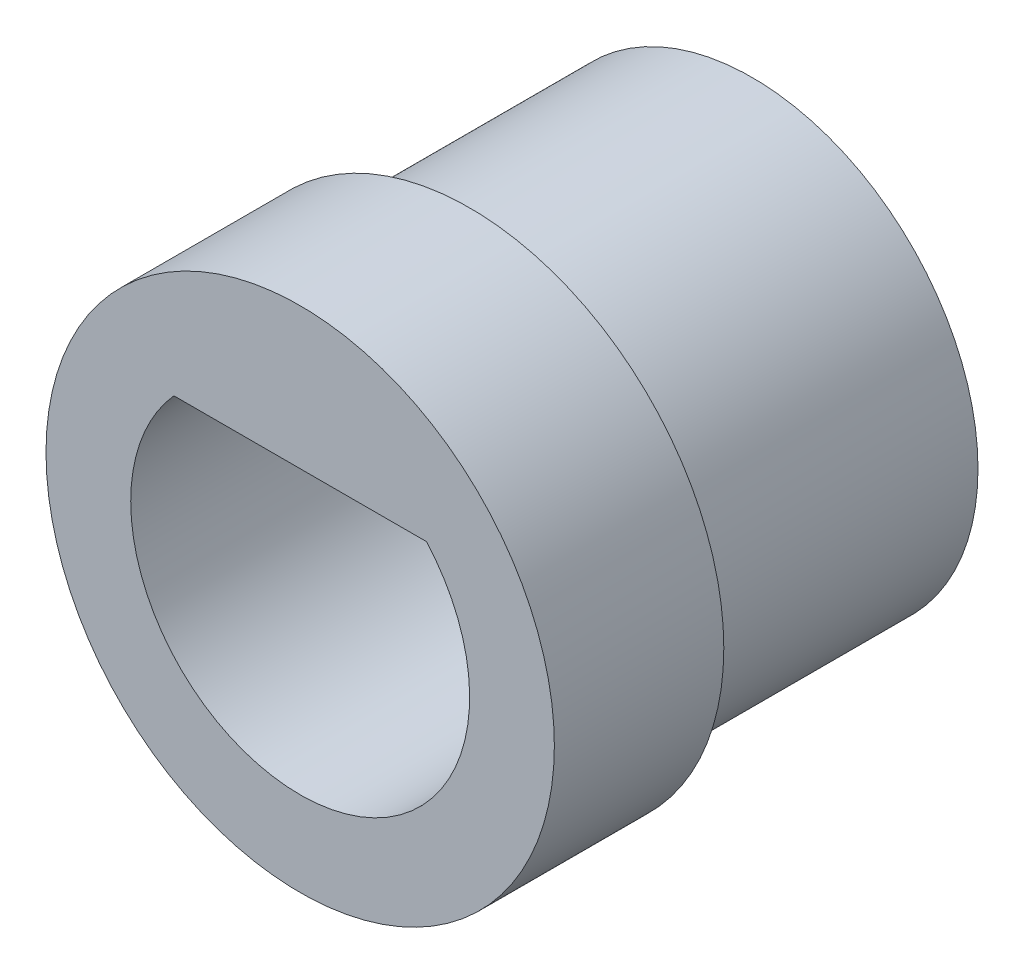
ISO-10303-21;
HEADER;
FILE_DESCRIPTION(('STEP AP214'),'2;1');
FILE_NAME('part.step','',(''),(''),'','','');
FILE_SCHEMA(('AUTOMOTIVE_DESIGN { 1 0 10303 214 1 1 1 1 }'));
ENDSEC;
DATA;
#1=APPLICATION_CONTEXT('core data for automotive mechanical design processes');
#2=APPLICATION_PROTOCOL_DEFINITION('international standard','automotive_design',2000,#1);
#3=PRODUCT_CONTEXT('',#1,'mechanical');
#4=PRODUCT('Part','Part','',(#3));
#5=PRODUCT_RELATED_PRODUCT_CATEGORY('part','',(#4));
#6=PRODUCT_DEFINITION_FORMATION('','',#4);
#7=PRODUCT_DEFINITION_CONTEXT('part definition',#1,'design');
#8=PRODUCT_DEFINITION('design','',#6,#7);
#9=PRODUCT_DEFINITION_SHAPE('','',#8);
#10=(LENGTH_UNIT() NAMED_UNIT(*) SI_UNIT(.MILLI.,.METRE.));
#11=(NAMED_UNIT(*) PLANE_ANGLE_UNIT() SI_UNIT($,.RADIAN.));
#12=(NAMED_UNIT(*) SI_UNIT($,.STERADIAN.) SOLID_ANGLE_UNIT());
#13=UNCERTAINTY_MEASURE_WITH_UNIT(LENGTH_MEASURE(1.E-05),#10,'distance_accuracy_value','');
#14=(GEOMETRIC_REPRESENTATION_CONTEXT(3) GLOBAL_UNCERTAINTY_ASSIGNED_CONTEXT((#13)) GLOBAL_UNIT_ASSIGNED_CONTEXT((#10,
#11,#12)) REPRESENTATION_CONTEXT('',''));
#15=CARTESIAN_POINT('',(0.,0.,0.));
#16=DIRECTION('',(0.,0.,1.));
#17=DIRECTION('',(1.,0.,0.));
#18=AXIS2_PLACEMENT_3D('',#15,#16,#17);
#19=CARTESIAN_POINT('',(0.,0.,3.));
#20=DIRECTION('',(0.,0.,-1.));
#21=DIRECTION('',(-1.,0.,0.));
#22=AXIS2_PLACEMENT_3D('',#19,#20,#21);
#23=CYLINDRICAL_SURFACE('',#22,3.);
#24=CARTESIAN_POINT('',(0.,0.,-5.));
#25=DIRECTION('',(0.,0.,-1.));
#26=DIRECTION('',(-1.,0.,0.));
#27=AXIS2_PLACEMENT_3D('',#24,#25,#26);
#28=CIRCLE('',#27,3.);
#29=CARTESIAN_POINT('',(-3.,0.,-5.));
#30=VERTEX_POINT('',#29);
#31=EDGE_CURVE('E11',#30,#30,#28,.T.);
#32=ORIENTED_EDGE('',*,*,#31,.T.);
#33=EDGE_LOOP('',(#32));
#34=FACE_BOUND('',#33,.T.);
#35=DIRECTION('',(0.,0.,-1.));
#36=VECTOR('',#35,1.);
#37=CARTESIAN_POINT('',(2.23606797749979,2.,3.));
#38=LINE('',#37,#36);
#39=CARTESIAN_POINT('',(2.23606797749979,2.,3.));
#40=VERTEX_POINT('',#39);
#41=CARTESIAN_POINT('',(2.23606797749979,2.,-2.));
#42=VERTEX_POINT('',#41);
#43=EDGE_CURVE('E24',#40,#42,#38,.T.);
#44=ORIENTED_EDGE('',*,*,#43,.T.);
#45=CARTESIAN_POINT('',(0.,0.,-2.));
#46=DIRECTION('',(0.,0.,-1.));
#47=DIRECTION('',(-1.,0.,0.));
#48=AXIS2_PLACEMENT_3D('',#45,#46,#47);
#49=CIRCLE('',#48,3.);
#50=CARTESIAN_POINT('',(-2.23606797749979,2.,-2.));
#51=VERTEX_POINT('',#50);
#52=EDGE_CURVE('E35',#51,#42,#49,.T.);
#53=ORIENTED_EDGE('',*,*,#52,.F.);
#54=DIRECTION('',(0.,0.,-1.));
#55=VECTOR('',#54,1.);
#56=CARTESIAN_POINT('',(-2.23606797749979,2.,3.));
#57=LINE('',#56,#55);
#58=CARTESIAN_POINT('',(-2.23606797749979,2.,3.));
#59=VERTEX_POINT('',#58);
#60=EDGE_CURVE('E43',#59,#51,#57,.T.);
#61=ORIENTED_EDGE('',*,*,#60,.F.);
#62=CARTESIAN_POINT('',(0.,0.,3.));
#63=DIRECTION('',(0.,0.,1.));
#64=DIRECTION('',(-1.,0.,0.));
#65=AXIS2_PLACEMENT_3D('',#62,#63,#64);
#66=CIRCLE('',#65,3.);
#67=EDGE_CURVE('E41',#59,#40,#66,.T.);
#68=ORIENTED_EDGE('',*,*,#67,.T.);
#69=EDGE_LOOP('',(#44,#53,#61,#68));
#70=FACE_BOUND('',#69,.T.);
#71=ADVANCED_FACE('F17',(#34,#70),#23,.F.);
#72=CARTESIAN_POINT('',(0.,0.,0.));
#73=DIRECTION('',(0.,0.,1.));
#74=DIRECTION('',(1.,0.,0.));
#75=AXIS2_PLACEMENT_3D('',#72,#73,#74);
#76=PLANE('',#75);
#77=CARTESIAN_POINT('',(0.,0.,0.));
#78=DIRECTION('',(0.,0.,1.));
#79=DIRECTION('',(1.,0.,0.));
#80=AXIS2_PLACEMENT_3D('',#77,#78,#79);
#81=CIRCLE('',#80,4.5);
#82=CARTESIAN_POINT('',(4.5,0.,0.));
#83=VERTEX_POINT('',#82);
#84=EDGE_CURVE('E46',#83,#83,#81,.T.);
#85=ORIENTED_EDGE('',*,*,#84,.F.);
#86=EDGE_LOOP('',(#85));
#87=FACE_BOUND('',#86,.T.);
#88=CARTESIAN_POINT('',(0.,0.,0.));
#89=DIRECTION('',(0.,0.,-1.));
#90=DIRECTION('',(-1.,0.,0.));
#91=AXIS2_PLACEMENT_3D('',#88,#89,#90);
#92=CIRCLE('',#91,4.);
#93=CARTESIAN_POINT('',(-4.,0.,0.));
#94=VERTEX_POINT('',#93);
#95=EDGE_CURVE('E61',#94,#94,#92,.T.);
#96=ORIENTED_EDGE('',*,*,#95,.F.);
#97=EDGE_LOOP('',(#96));
#98=FACE_BOUND('',#97,.T.);
#99=ADVANCED_FACE('F81',(#87,#98),#76,.F.);
#100=CARTESIAN_POINT('',(0.,0.,3.));
#101=DIRECTION('',(0.,0.,1.));
#102=DIRECTION('',(1.,0.,0.));
#103=AXIS2_PLACEMENT_3D('',#100,#101,#102);
#104=PLANE('',#103);
#105=CARTESIAN_POINT('',(0.,0.,3.));
#106=DIRECTION('',(0.,0.,1.));
#107=DIRECTION('',(1.,0.,0.));
#108=AXIS2_PLACEMENT_3D('',#105,#106,#107);
#109=CIRCLE('',#108,4.5);
#110=CARTESIAN_POINT('',(4.5,0.,3.));
#111=VERTEX_POINT('',#110);
#112=EDGE_CURVE('E51',#111,#111,#109,.T.);
#113=ORIENTED_EDGE('',*,*,#112,.T.);
#114=EDGE_LOOP('',(#113));
#115=FACE_BOUND('',#114,.T.);
#116=DIRECTION('',(-1.,0.,0.));
#117=VECTOR('',#116,1.);
#118=CARTESIAN_POINT('',(2.23606797749979,2.,3.));
#119=LINE('',#118,#117);
#120=EDGE_CURVE('E48',#40,#59,#119,.T.);
#121=ORIENTED_EDGE('',*,*,#120,.F.);
#122=ORIENTED_EDGE('',*,*,#67,.F.);
#123=EDGE_LOOP('',(#121,#122));
#124=FACE_BOUND('',#123,.T.);
#125=ADVANCED_FACE('F49',(#115,#124),#104,.T.);
#126=CARTESIAN_POINT('',(0.,0.,3.));
#127=DIRECTION('',(0.,0.,-1.));
#128=DIRECTION('',(-1.,0.,0.));
#129=AXIS2_PLACEMENT_3D('',#126,#127,#128);
#130=CYLINDRICAL_SURFACE('',#129,4.5);
#131=ORIENTED_EDGE('',*,*,#112,.F.);
#132=EDGE_LOOP('',(#131));
#133=FACE_BOUND('',#132,.T.);
#134=ORIENTED_EDGE('',*,*,#84,.T.);
#135=EDGE_LOOP('',(#134));
#136=FACE_BOUND('',#135,.T.);
#137=ADVANCED_FACE('F89',(#133,#136),#130,.T.);
#138=CARTESIAN_POINT('',(2.23606797749979,2.,3.));
#139=DIRECTION('',(0.,-1.,0.));
#140=DIRECTION('',(0.,0.,-1.));
#141=AXIS2_PLACEMENT_3D('',#138,#139,#140);
#142=PLANE('',#141);
#143=ORIENTED_EDGE('',*,*,#60,.T.);
#144=DIRECTION('',(-1.,0.,0.));
#145=VECTOR('',#144,1.);
#146=CARTESIAN_POINT('',(2.23606797749979,2.,-2.));
#147=LINE('',#146,#145);
#148=EDGE_CURVE('E52',#42,#51,#147,.T.);
#149=ORIENTED_EDGE('',*,*,#148,.F.);
#150=ORIENTED_EDGE('',*,*,#43,.F.);
#151=ORIENTED_EDGE('',*,*,#120,.T.);
#152=EDGE_LOOP('',(#143,#149,#150,#151));
#153=FACE_BOUND('',#152,.T.);
#154=ADVANCED_FACE('F54',(#153),#142,.T.);
#155=CARTESIAN_POINT('',(0.,0.,-5.));
#156=DIRECTION('',(0.,0.,-1.));
#157=DIRECTION('',(-1.,0.,0.));
#158=AXIS2_PLACEMENT_3D('',#155,#156,#157);
#159=PLANE('',#158);
#160=CARTESIAN_POINT('',(0.,0.,-5.));
#161=DIRECTION('',(0.,0.,-1.));
#162=DIRECTION('',(-1.,0.,0.));
#163=AXIS2_PLACEMENT_3D('',#160,#161,#162);
#164=CIRCLE('',#163,4.);
#165=CARTESIAN_POINT('',(-4.,0.,-5.));
#166=VERTEX_POINT('',#165);
#167=EDGE_CURVE('E67',#166,#166,#164,.T.);
#168=ORIENTED_EDGE('',*,*,#167,.T.);
#169=EDGE_LOOP('',(#168));
#170=FACE_BOUND('',#169,.T.);
#171=ORIENTED_EDGE('',*,*,#31,.F.);
#172=EDGE_LOOP('',(#171));
#173=FACE_BOUND('',#172,.T.);
#174=ADVANCED_FACE('F71',(#170,#173),#159,.T.);
#175=CARTESIAN_POINT('',(0.,0.,-5.));
#176=DIRECTION('',(0.,0.,1.));
#177=DIRECTION('',(1.,0.,0.));
#178=AXIS2_PLACEMENT_3D('',#175,#176,#177);
#179=CYLINDRICAL_SURFACE('',#178,4.);
#180=ORIENTED_EDGE('',*,*,#167,.F.);
#181=EDGE_LOOP('',(#180));
#182=FACE_BOUND('',#181,.T.);
#183=ORIENTED_EDGE('',*,*,#95,.T.);
#184=EDGE_LOOP('',(#183));
#185=FACE_BOUND('',#184,.T.);
#186=ADVANCED_FACE('F74',(#182,#185),#179,.T.);
#187=CARTESIAN_POINT('',(0.,0.,-2.));
#188=DIRECTION('',(0.,0.,-1.));
#189=DIRECTION('',(-1.,0.,0.));
#190=AXIS2_PLACEMENT_3D('',#187,#188,#189);
#191=PLANE('',#190);
#192=ORIENTED_EDGE('',*,*,#52,.T.);
#193=ORIENTED_EDGE('',*,*,#148,.T.);
#194=EDGE_LOOP('',(#192,#193));
#195=FACE_BOUND('',#194,.T.);
#196=ADVANCED_FACE('F77',(#195),#191,.T.);
#197=CLOSED_SHELL('',(#71,#99,#125,#137,#154,#174,#186,#196));
#198=MANIFOLD_SOLID_BREP('B1',#197);
#199=ADVANCED_BREP_SHAPE_REPRESENTATION('',(#18,#198),#14);
#200=SHAPE_DEFINITION_REPRESENTATION(#9,#199);
ENDSEC;
END-ISO-10303-21;
